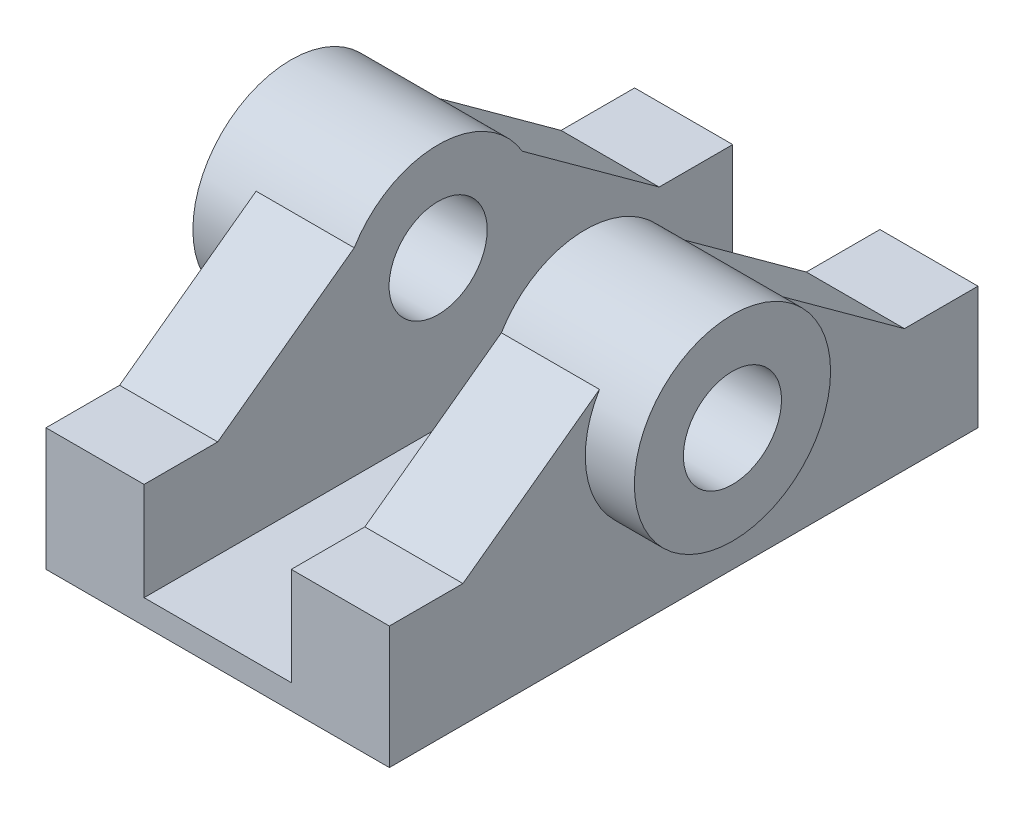
ISO-10303-21;
HEADER;
FILE_DESCRIPTION(('STEP AP214'),'2;1');
FILE_NAME('part.step','',(''),(''),'','','');
FILE_SCHEMA(('AUTOMOTIVE_DESIGN { 1 0 10303 214 1 1 1 1 }'));
ENDSEC;
DATA;
#1=APPLICATION_CONTEXT('core data for automotive mechanical design processes');
#2=APPLICATION_PROTOCOL_DEFINITION('international standard','automotive_design',2000,#1);
#3=PRODUCT_CONTEXT('',#1,'mechanical');
#4=PRODUCT('Part','Part','',(#3));
#5=PRODUCT_RELATED_PRODUCT_CATEGORY('part','',(#4));
#6=PRODUCT_DEFINITION_FORMATION('','',#4);
#7=PRODUCT_DEFINITION_CONTEXT('part definition',#1,'design');
#8=PRODUCT_DEFINITION('design','',#6,#7);
#9=PRODUCT_DEFINITION_SHAPE('','',#8);
#10=(LENGTH_UNIT() NAMED_UNIT(*) SI_UNIT(.MILLI.,.METRE.));
#11=(NAMED_UNIT(*) PLANE_ANGLE_UNIT() SI_UNIT($,.RADIAN.));
#12=(NAMED_UNIT(*) SI_UNIT($,.STERADIAN.) SOLID_ANGLE_UNIT());
#13=UNCERTAINTY_MEASURE_WITH_UNIT(LENGTH_MEASURE(1.E-05),#10,'distance_accuracy_value','');
#14=(GEOMETRIC_REPRESENTATION_CONTEXT(3) GLOBAL_UNCERTAINTY_ASSIGNED_CONTEXT((#13)) GLOBAL_UNIT_ASSIGNED_CONTEXT((#10,
#11,#12)) REPRESENTATION_CONTEXT('',''));
#15=CARTESIAN_POINT('',(0.,0.,0.));
#16=DIRECTION('',(0.,0.,1.));
#17=DIRECTION('',(1.,0.,0.));
#18=AXIS2_PLACEMENT_3D('',#15,#16,#17);
#19=CARTESIAN_POINT('',(-20.,40.0649013305199,-29.114446320478));
#20=DIRECTION('',(0.,0.808963302781296,-0.587859145334303));
#21=DIRECTION('',(0.,0.587859145334303,0.808963302781296));
#22=AXIS2_PLACEMENT_3D('',#19,#20,#21);
#23=PLANE('',#22);
#24=DIRECTION('',(0.,0.587859145334303,0.808963302781296));
#25=VECTOR('',#24,1.);
#26=CARTESIAN_POINT('',(0.,40.0649013305199,-29.114446320478));
#27=LINE('',#26,#25);
#28=CARTESIAN_POINT('',(0.,25.,-49.8455218393954));
#29=VERTEX_POINT('',#28);
#30=CARTESIAN_POINT('',(0.,45.2708196570423,-21.9504906061575));
#31=VERTEX_POINT('',#30);
#32=EDGE_CURVE('E147',#29,#31,#27,.T.);
#33=ORIENTED_EDGE('',*,*,#32,.F.);
#34=DIRECTION('',(1.,0.,0.));
#35=VECTOR('',#34,1.);
#36=CARTESIAN_POINT('',(-20.,25.,-49.8455218393954));
#37=LINE('',#36,#35);
#38=CARTESIAN_POINT('',(-20.,25.,-49.8455218393954));
#39=VERTEX_POINT('',#38);
#40=EDGE_CURVE('E47',#39,#29,#37,.T.);
#41=ORIENTED_EDGE('',*,*,#40,.F.);
#42=DIRECTION('',(0.,0.587859145334303,0.808963302781296));
#43=VECTOR('',#42,1.);
#44=CARTESIAN_POINT('',(-20.,40.0649013305199,-29.114446320478));
#45=LINE('',#44,#43);
#46=CARTESIAN_POINT('',(-20.,45.2708196570423,-21.9504906061575));
#47=VERTEX_POINT('',#46);
#48=EDGE_CURVE('E166',#39,#47,#45,.T.);
#49=ORIENTED_EDGE('',*,*,#48,.T.);
#50=DIRECTION('',(1.,0.,0.));
#51=VECTOR('',#50,1.);
#52=CARTESIAN_POINT('',(-20.,45.2708196570423,-21.9504906061575));
#53=LINE('',#52,#51);
#54=EDGE_CURVE('E42',#47,#31,#53,.T.);
#55=ORIENTED_EDGE('',*,*,#54,.T.);
#56=EDGE_LOOP('',(#33,#41,#49,#55));
#57=FACE_BOUND('',#56,.T.);
#58=ADVANCED_FACE('F39',(#57),#23,.T.);
#59=CARTESIAN_POINT('',(-20.,25.,0.));
#60=DIRECTION('',(0.,1.,0.));
#61=DIRECTION('',(0.,0.,1.));
#62=AXIS2_PLACEMENT_3D('',#59,#60,#61);
#63=PLANE('',#62);
#64=DIRECTION('',(0.,0.,1.));
#65=VECTOR('',#64,1.);
#66=CARTESIAN_POINT('',(0.,25.,0.));
#67=LINE('',#66,#65);
#68=CARTESIAN_POINT('',(0.,25.,-64.8455218393954));
#69=VERTEX_POINT('',#68);
#70=EDGE_CURVE('E163',#69,#29,#67,.T.);
#71=ORIENTED_EDGE('',*,*,#70,.F.);
#72=DIRECTION('',(1.,0.,0.));
#73=VECTOR('',#72,1.);
#74=CARTESIAN_POINT('',(-20.,25.,-64.8455218393954));
#75=LINE('',#74,#73);
#76=CARTESIAN_POINT('',(-20.,25.,-64.8455218393954));
#77=VERTEX_POINT('',#76);
#78=EDGE_CURVE('E168',#77,#69,#75,.T.);
#79=ORIENTED_EDGE('',*,*,#78,.F.);
#80=DIRECTION('',(0.,0.,1.));
#81=VECTOR('',#80,1.);
#82=CARTESIAN_POINT('',(-20.,25.,0.));
#83=LINE('',#82,#81);
#84=EDGE_CURVE('E142',#77,#39,#83,.T.);
#85=ORIENTED_EDGE('',*,*,#84,.T.);
#86=ORIENTED_EDGE('',*,*,#40,.T.);
#87=EDGE_LOOP('',(#71,#79,#85,#86));
#88=FACE_BOUND('',#87,.T.);
#89=ADVANCED_FACE('F184',(#88),#63,.T.);
#90=CARTESIAN_POINT('',(-20.,0.,-64.8455218393954));
#91=DIRECTION('',(0.,0.,-1.));
#92=DIRECTION('',(0.,1.,0.));
#93=AXIS2_PLACEMENT_3D('',#90,#91,#92);
#94=PLANE('',#93);
#95=DIRECTION('',(0.,1.,0.));
#96=VECTOR('',#95,1.);
#97=CARTESIAN_POINT('',(0.,0.,-64.8455218393954));
#98=LINE('',#97,#96);
#99=CARTESIAN_POINT('',(0.,0.,-64.8455218393954));
#100=VERTEX_POINT('',#99);
#101=EDGE_CURVE('E160',#100,#69,#98,.T.);
#102=ORIENTED_EDGE('',*,*,#101,.F.);
#103=DIRECTION('',(1.,0.,0.));
#104=VECTOR('',#103,1.);
#105=CARTESIAN_POINT('',(-20.,0.,-64.8455218393954));
#106=LINE('',#105,#104);
#107=CARTESIAN_POINT('',(-70.,0.,-64.8455218393954));
#108=VERTEX_POINT('',#107);
#109=EDGE_CURVE('E170',#108,#100,#106,.T.);
#110=ORIENTED_EDGE('',*,*,#109,.F.);
#111=DIRECTION('',(0.,1.,0.));
#112=VECTOR('',#111,1.);
#113=CARTESIAN_POINT('',(-70.,0.,-64.8455218393954));
#114=LINE('',#113,#112);
#115=CARTESIAN_POINT('',(-70.,25.,-64.8455218393954));
#116=VERTEX_POINT('',#115);
#117=EDGE_CURVE('E223',#108,#116,#114,.T.);
#118=ORIENTED_EDGE('',*,*,#117,.T.);
#119=DIRECTION('',(-1.,0.,0.));
#120=VECTOR('',#119,1.);
#121=CARTESIAN_POINT('',(-50.,25.,-64.8455218393954));
#122=LINE('',#121,#120);
#123=CARTESIAN_POINT('',(-50.,25.,-64.8455218393954));
#124=VERTEX_POINT('',#123);
#125=EDGE_CURVE('E213',#124,#116,#122,.T.);
#126=ORIENTED_EDGE('',*,*,#125,.F.);
#127=DIRECTION('',(0.,1.,0.));
#128=VECTOR('',#127,1.);
#129=CARTESIAN_POINT('',(-50.,0.,-64.8455218393954));
#130=LINE('',#129,#128);
#131=CARTESIAN_POINT('',(-50.,5.,-64.8455218393954));
#132=VERTEX_POINT('',#131);
#133=EDGE_CURVE('E247',#132,#124,#130,.T.);
#134=ORIENTED_EDGE('',*,*,#133,.F.);
#135=DIRECTION('',(-1.,0.,0.));
#136=VECTOR('',#135,1.);
#137=CARTESIAN_POINT('',(-35.,5.,-64.8455218393954));
#138=LINE('',#137,#136);
#139=CARTESIAN_POINT('',(-20.,5.,-64.8455218393954));
#140=VERTEX_POINT('',#139);
#141=EDGE_CURVE('E195',#140,#132,#138,.T.);
#142=ORIENTED_EDGE('',*,*,#141,.F.);
#143=DIRECTION('',(0.,1.,0.));
#144=VECTOR('',#143,1.);
#145=CARTESIAN_POINT('',(-20.,0.,-64.8455218393954));
#146=LINE('',#145,#144);
#147=EDGE_CURVE('E120',#140,#77,#146,.T.);
#148=ORIENTED_EDGE('',*,*,#147,.T.);
#149=ORIENTED_EDGE('',*,*,#78,.T.);
#150=EDGE_LOOP('',(#102,#110,#118,#126,#134,#142,#148,#149));
#151=FACE_BOUND('',#150,.T.);
#152=ADVANCED_FACE('F318',(#151),#94,.T.);
#153=CARTESIAN_POINT('',(-20.,0.,0.));
#154=DIRECTION('',(0.,-1.,0.));
#155=DIRECTION('',(0.,0.,-1.));
#156=AXIS2_PLACEMENT_3D('',#153,#154,#155);
#157=PLANE('',#156);
#158=DIRECTION('',(0.,0.,-1.));
#159=VECTOR('',#158,1.);
#160=CARTESIAN_POINT('',(0.,0.,0.));
#161=LINE('',#160,#159);
#162=CARTESIAN_POINT('',(0.,0.,55.1544781606046));
#163=VERTEX_POINT('',#162);
#164=EDGE_CURVE('E157',#163,#100,#161,.T.);
#165=ORIENTED_EDGE('',*,*,#164,.F.);
#166=DIRECTION('',(1.,0.,0.));
#167=VECTOR('',#166,1.);
#168=CARTESIAN_POINT('',(-20.,0.,55.1544781606046));
#169=LINE('',#168,#167);
#170=CARTESIAN_POINT('',(-70.,0.,55.1544781606046));
#171=VERTEX_POINT('',#170);
#172=EDGE_CURVE('E129',#171,#163,#169,.T.);
#173=ORIENTED_EDGE('',*,*,#172,.F.);
#174=DIRECTION('',(0.,0.,-1.));
#175=VECTOR('',#174,1.);
#176=CARTESIAN_POINT('',(-70.,0.,0.));
#177=LINE('',#176,#175);
#178=EDGE_CURVE('E226',#171,#108,#177,.T.);
#179=ORIENTED_EDGE('',*,*,#178,.T.);
#180=ORIENTED_EDGE('',*,*,#109,.T.);
#181=EDGE_LOOP('',(#165,#173,#179,#180));
#182=FACE_BOUND('',#181,.T.);
#183=ADVANCED_FACE('F349',(#182),#157,.T.);
#184=CARTESIAN_POINT('',(-20.,0.,55.1544781606046));
#185=DIRECTION('',(0.,0.,-1.));
#186=DIRECTION('',(-1.,0.,0.));
#187=AXIS2_PLACEMENT_3D('',#184,#185,#186);
#188=PLANE('',#187);
#189=DIRECTION('',(0.,1.,0.));
#190=VECTOR('',#189,1.);
#191=CARTESIAN_POINT('',(0.,0.,55.1544781606046));
#192=LINE('',#191,#190);
#193=CARTESIAN_POINT('',(0.,25.,55.1544781606046));
#194=VERTEX_POINT('',#193);
#195=EDGE_CURVE('E126',#163,#194,#192,.T.);
#196=ORIENTED_EDGE('',*,*,#195,.T.);
#197=DIRECTION('',(1.,0.,0.));
#198=VECTOR('',#197,1.);
#199=CARTESIAN_POINT('',(-20.,25.,55.1544781606046));
#200=LINE('',#199,#198);
#201=CARTESIAN_POINT('',(-20.,25.,55.1544781606046));
#202=VERTEX_POINT('',#201);
#203=EDGE_CURVE('E123',#202,#194,#200,.T.);
#204=ORIENTED_EDGE('',*,*,#203,.F.);
#205=DIRECTION('',(0.,1.,0.));
#206=VECTOR('',#205,1.);
#207=CARTESIAN_POINT('',(-20.,0.,55.1544781606046));
#208=LINE('',#207,#206);
#209=CARTESIAN_POINT('',(-20.,5.,55.1544781606046));
#210=VERTEX_POINT('',#209);
#211=EDGE_CURVE('E110',#210,#202,#208,.T.);
#212=ORIENTED_EDGE('',*,*,#211,.F.);
#213=DIRECTION('',(-1.,0.,0.));
#214=VECTOR('',#213,1.);
#215=CARTESIAN_POINT('',(-35.,5.,55.1544781606046));
#216=LINE('',#215,#214);
#217=CARTESIAN_POINT('',(-50.,5.,55.1544781606046));
#218=VERTEX_POINT('',#217);
#219=EDGE_CURVE('E55',#210,#218,#216,.T.);
#220=ORIENTED_EDGE('',*,*,#219,.T.);
#221=DIRECTION('',(0.,1.,0.));
#222=VECTOR('',#221,1.);
#223=CARTESIAN_POINT('',(-50.,0.,55.1544781606046));
#224=LINE('',#223,#222);
#225=CARTESIAN_POINT('',(-50.,25.,55.1544781606046));
#226=VERTEX_POINT('',#225);
#227=EDGE_CURVE('E250',#218,#226,#224,.T.);
#228=ORIENTED_EDGE('',*,*,#227,.T.);
#229=DIRECTION('',(-1.,0.,0.));
#230=VECTOR('',#229,1.);
#231=CARTESIAN_POINT('',(-50.,25.,55.1544781606046));
#232=LINE('',#231,#230);
#233=CARTESIAN_POINT('',(-70.,25.,55.1544781606046));
#234=VERTEX_POINT('',#233);
#235=EDGE_CURVE('E210',#226,#234,#232,.T.);
#236=ORIENTED_EDGE('',*,*,#235,.T.);
#237=DIRECTION('',(0.,1.,0.));
#238=VECTOR('',#237,1.);
#239=CARTESIAN_POINT('',(-70.,0.,55.1544781606046));
#240=LINE('',#239,#238);
#241=EDGE_CURVE('E229',#171,#234,#240,.T.);
#242=ORIENTED_EDGE('',*,*,#241,.F.);
#243=ORIENTED_EDGE('',*,*,#172,.T.);
#244=EDGE_LOOP('',(#196,#204,#212,#220,#228,#236,#242,#243));
#245=FACE_BOUND('',#244,.T.);
#246=ADVANCED_FACE('F124',(#245),#188,.F.);
#247=CARTESIAN_POINT('',(-20.,25.,0.));
#248=DIRECTION('',(0.,-1.,0.));
#249=DIRECTION('',(0.,0.,-1.));
#250=AXIS2_PLACEMENT_3D('',#247,#248,#249);
#251=PLANE('',#250);
#252=DIRECTION('',(0.,0.,-1.));
#253=VECTOR('',#252,1.);
#254=CARTESIAN_POINT('',(0.,25.,0.));
#255=LINE('',#254,#253);
#256=CARTESIAN_POINT('',(0.,25.,40.1544781606046));
#257=VERTEX_POINT('',#256);
#258=EDGE_CURVE('E154',#194,#257,#255,.T.);
#259=ORIENTED_EDGE('',*,*,#258,.T.);
#260=DIRECTION('',(1.,0.,0.));
#261=VECTOR('',#260,1.);
#262=CARTESIAN_POINT('',(-20.,25.,40.1544781606046));
#263=LINE('',#262,#261);
#264=CARTESIAN_POINT('',(-20.,25.,40.1544781606046));
#265=VERTEX_POINT('',#264);
#266=EDGE_CURVE('E130',#265,#257,#263,.T.);
#267=ORIENTED_EDGE('',*,*,#266,.F.);
#268=DIRECTION('',(0.,0.,-1.));
#269=VECTOR('',#268,1.);
#270=CARTESIAN_POINT('',(-20.,25.,0.));
#271=LINE('',#270,#269);
#272=EDGE_CURVE('E116',#202,#265,#271,.T.);
#273=ORIENTED_EDGE('',*,*,#272,.F.);
#274=ORIENTED_EDGE('',*,*,#203,.T.);
#275=EDGE_LOOP('',(#259,#267,#273,#274));
#276=FACE_BOUND('',#275,.T.);
#277=ADVANCED_FACE('F132',(#276),#251,.F.);
#278=CARTESIAN_POINT('',(-20.,35.4212757104404,25.9048156686958));
#279=DIRECTION('',(0.,-0.807173552318652,-0.590314201453166));
#280=DIRECTION('',(0.,0.590314201453166,-0.807173552318652));
#281=AXIS2_PLACEMENT_3D('',#278,#279,#280);
#282=PLANE('',#281);
#283=DIRECTION('',(0.,0.590314201453166,-0.807173552318652));
#284=VECTOR('',#283,1.);
#285=CARTESIAN_POINT('',(0.,35.4212757104404,25.9048156686958));
#286=LINE('',#285,#284);
#287=CARTESIAN_POINT('',(0.,45.3554759904996,12.3211618962454));
#288=VERTEX_POINT('',#287);
#289=EDGE_CURVE('E150',#257,#288,#286,.T.);
#290=ORIENTED_EDGE('',*,*,#289,.T.);
#291=DIRECTION('',(1.,0.,0.));
#292=VECTOR('',#291,1.);
#293=CARTESIAN_POINT('',(-20.,45.3554759904996,12.3211618962454));
#294=LINE('',#293,#292);
#295=CARTESIAN_POINT('',(-20.,45.3554759904996,12.3211618962454));
#296=VERTEX_POINT('',#295);
#297=EDGE_CURVE('E173',#296,#288,#294,.T.);
#298=ORIENTED_EDGE('',*,*,#297,.F.);
#299=DIRECTION('',(0.,0.590314201453166,-0.807173552318652));
#300=VECTOR('',#299,1.);
#301=CARTESIAN_POINT('',(-20.,35.4212757104404,25.9048156686958));
#302=LINE('',#301,#300);
#303=EDGE_CURVE('E135',#265,#296,#302,.T.);
#304=ORIENTED_EDGE('',*,*,#303,.F.);
#305=ORIENTED_EDGE('',*,*,#266,.T.);
#306=EDGE_LOOP('',(#290,#298,#304,#305));
#307=FACE_BOUND('',#306,.T.);
#308=ADVANCED_FACE('F469',(#307),#282,.F.);
#309=CARTESIAN_POINT('',(-20.,35.,-4.7891892693557));
#310=DIRECTION('',(1.,0.,0.));
#311=DIRECTION('',(0.,0.,-1.));
#312=AXIS2_PLACEMENT_3D('',#309,#310,#311);
#313=CYLINDRICAL_SURFACE('',#312,20.);
#314=ORIENTED_EDGE('',*,*,#297,.T.);
#315=CARTESIAN_POINT('',(0.,35.,-4.7891892693557));
#316=DIRECTION('',(1.,0.,0.));
#317=DIRECTION('',(0.,0.,-1.));
#318=AXIS2_PLACEMENT_3D('',#315,#316,#317);
#319=CIRCLE('',#318,20.);
#320=EDGE_CURVE('E11',#288,#31,#319,.T.);
#321=ORIENTED_EDGE('',*,*,#320,.T.);
#322=ORIENTED_EDGE('',*,*,#54,.F.);
#323=CARTESIAN_POINT('',(-20.,35.,-4.7891892693557));
#324=DIRECTION('',(1.,0.,0.));
#325=DIRECTION('',(0.,0.,-1.));
#326=AXIS2_PLACEMENT_3D('',#323,#324,#325);
#327=CIRCLE('',#326,20.);
#328=EDGE_CURVE('E137',#47,#296,#327,.T.);
#329=ORIENTED_EDGE('',*,*,#328,.T.);
#330=EDGE_LOOP('',(#314,#321,#322,#329));
#331=FACE_BOUND('',#330,.T.);
#332=CARTESIAN_POINT('',(10.,35.,-4.7891892693557));
#333=DIRECTION('',(1.,0.,0.));
#334=DIRECTION('',(0.,0.,-1.));
#335=AXIS2_PLACEMENT_3D('',#332,#333,#334);
#336=CIRCLE('',#335,20.);
#337=CARTESIAN_POINT('',(10.,35.,-24.7891892693557));
#338=VERTEX_POINT('',#337);
#339=EDGE_CURVE('E151',#338,#338,#336,.T.);
#340=ORIENTED_EDGE('',*,*,#339,.F.);
#341=EDGE_LOOP('',(#340));
#342=FACE_BOUND('',#341,.T.);
#343=ADVANCED_FACE('F177',(#331,#342),#313,.T.);
#344=CARTESIAN_POINT('',(-20.,35.,-4.7891892693557));
#345=DIRECTION('',(1.,0.,0.));
#346=DIRECTION('',(0.,0.,-1.));
#347=AXIS2_PLACEMENT_3D('',#344,#345,#346);
#348=CYLINDRICAL_SURFACE('',#347,10.);
#349=CARTESIAN_POINT('',(-20.,35.,-4.7891892693557));
#350=DIRECTION('',(1.,0.,0.));
#351=DIRECTION('',(0.,0.,-1.));
#352=AXIS2_PLACEMENT_3D('',#349,#350,#351);
#353=CIRCLE('',#352,10.);
#354=CARTESIAN_POINT('',(-20.,35.,-14.7891892693557));
#355=VERTEX_POINT('',#354);
#356=EDGE_CURVE('E144',#355,#355,#353,.T.);
#357=ORIENTED_EDGE('',*,*,#356,.F.);
#358=EDGE_LOOP('',(#357));
#359=FACE_BOUND('',#358,.T.);
#360=CARTESIAN_POINT('',(10.,35.,-4.7891892693557));
#361=DIRECTION('',(1.,0.,0.));
#362=DIRECTION('',(0.,0.,-1.));
#363=AXIS2_PLACEMENT_3D('',#360,#361,#362);
#364=CIRCLE('',#363,10.);
#365=CARTESIAN_POINT('',(10.,35.,-14.7891892693557));
#366=VERTEX_POINT('',#365);
#367=EDGE_CURVE('E191',#366,#366,#364,.T.);
#368=ORIENTED_EDGE('',*,*,#367,.T.);
#369=EDGE_LOOP('',(#368));
#370=FACE_BOUND('',#369,.T.);
#371=ADVANCED_FACE('F366',(#359,#370),#348,.F.);
#372=CARTESIAN_POINT('',(-20.,0.,0.));
#373=DIRECTION('',(1.,0.,0.));
#374=DIRECTION('',(0.,0.,-1.));
#375=AXIS2_PLACEMENT_3D('',#372,#373,#374);
#376=PLANE('',#375);
#377=ORIENTED_EDGE('',*,*,#147,.F.);
#378=DIRECTION('',(0.,0.,1.));
#379=VECTOR('',#378,1.);
#380=CARTESIAN_POINT('',(-20.,5.,-64.8455218393954));
#381=LINE('',#380,#379);
#382=EDGE_CURVE('E118',#140,#210,#381,.T.);
#383=ORIENTED_EDGE('',*,*,#382,.T.);
#384=ORIENTED_EDGE('',*,*,#211,.T.);
#385=ORIENTED_EDGE('',*,*,#272,.T.);
#386=ORIENTED_EDGE('',*,*,#303,.T.);
#387=ORIENTED_EDGE('',*,*,#328,.F.);
#388=ORIENTED_EDGE('',*,*,#48,.F.);
#389=ORIENTED_EDGE('',*,*,#84,.F.);
#390=EDGE_LOOP('',(#377,#383,#384,#385,#386,#387,#388,#389));
#391=FACE_BOUND('',#390,.T.);
#392=ORIENTED_EDGE('',*,*,#356,.T.);
#393=EDGE_LOOP('',(#392));
#394=FACE_BOUND('',#393,.T.);
#395=ADVANCED_FACE('F113',(#391,#394),#376,.F.);
#396=CARTESIAN_POINT('',(0.,0.,0.));
#397=DIRECTION('',(1.,0.,0.));
#398=DIRECTION('',(0.,0.,-1.));
#399=AXIS2_PLACEMENT_3D('',#396,#397,#398);
#400=PLANE('',#399);
#401=ORIENTED_EDGE('',*,*,#320,.F.);
#402=ORIENTED_EDGE('',*,*,#289,.F.);
#403=ORIENTED_EDGE('',*,*,#258,.F.);
#404=ORIENTED_EDGE('',*,*,#195,.F.);
#405=ORIENTED_EDGE('',*,*,#164,.T.);
#406=ORIENTED_EDGE('',*,*,#101,.T.);
#407=ORIENTED_EDGE('',*,*,#70,.T.);
#408=ORIENTED_EDGE('',*,*,#32,.T.);
#409=EDGE_LOOP('',(#401,#402,#403,#404,#405,#406,#407,#408));
#410=FACE_BOUND('',#409,.T.);
#411=ADVANCED_FACE('F181',(#410),#400,.T.);
#412=CARTESIAN_POINT('',(10.,35.,-4.7891892693557));
#413=DIRECTION('',(1.,0.,0.));
#414=DIRECTION('',(0.,0.,-1.));
#415=AXIS2_PLACEMENT_3D('',#412,#413,#414);
#416=PLANE('',#415);
#417=ORIENTED_EDGE('',*,*,#339,.T.);
#418=EDGE_LOOP('',(#417));
#419=FACE_BOUND('',#418,.T.);
#420=ORIENTED_EDGE('',*,*,#367,.F.);
#421=EDGE_LOOP('',(#420));
#422=FACE_BOUND('',#421,.T.);
#423=ADVANCED_FACE('F372',(#419,#422),#416,.T.);
#424=CARTESIAN_POINT('',(-35.,5.,-64.8455218393954));
#425=DIRECTION('',(0.,1.,0.));
#426=DIRECTION('',(0.,0.,1.));
#427=AXIS2_PLACEMENT_3D('',#424,#425,#426);
#428=PLANE('',#427);
#429=ORIENTED_EDGE('',*,*,#219,.F.);
#430=ORIENTED_EDGE('',*,*,#382,.F.);
#431=ORIENTED_EDGE('',*,*,#141,.T.);
#432=DIRECTION('',(0.,0.,1.));
#433=VECTOR('',#432,1.);
#434=CARTESIAN_POINT('',(-50.,5.,-64.8455218393954));
#435=LINE('',#434,#433);
#436=EDGE_CURVE('E271',#132,#218,#435,.T.);
#437=ORIENTED_EDGE('',*,*,#436,.T.);
#438=EDGE_LOOP('',(#429,#430,#431,#437));
#439=FACE_BOUND('',#438,.T.);
#440=ADVANCED_FACE('F275',(#439),#428,.T.);
#441=CARTESIAN_POINT('',(-50.,40.0649013305199,-29.114446320478));
#442=DIRECTION('',(0.,0.808963302781296,-0.587859145334303));
#443=DIRECTION('',(0.,0.587859145334303,0.808963302781296));
#444=AXIS2_PLACEMENT_3D('',#441,#442,#443);
#445=PLANE('',#444);
#446=DIRECTION('',(0.,0.587859145334303,0.808963302781296));
#447=VECTOR('',#446,1.);
#448=CARTESIAN_POINT('',(-70.,40.0649013305199,-29.114446320478));
#449=LINE('',#448,#447);
#450=CARTESIAN_POINT('',(-70.,25.,-49.8455218393954));
#451=VERTEX_POINT('',#450);
#452=CARTESIAN_POINT('',(-70.,45.2708196570423,-21.9504906061575));
#453=VERTEX_POINT('',#452);
#454=EDGE_CURVE('E238',#451,#453,#449,.T.);
#455=ORIENTED_EDGE('',*,*,#454,.T.);
#456=DIRECTION('',(-1.,0.,0.));
#457=VECTOR('',#456,1.);
#458=CARTESIAN_POINT('',(-50.,45.2708196570423,-21.9504906061575));
#459=LINE('',#458,#457);
#460=CARTESIAN_POINT('',(-50.,45.2708196570423,-21.9504906061575));
#461=VERTEX_POINT('',#460);
#462=EDGE_CURVE('E200',#461,#453,#459,.T.);
#463=ORIENTED_EDGE('',*,*,#462,.F.);
#464=DIRECTION('',(0.,0.587859145334303,0.808963302781296));
#465=VECTOR('',#464,1.);
#466=CARTESIAN_POINT('',(-50.,40.0649013305199,-29.114446320478));
#467=LINE('',#466,#465);
#468=CARTESIAN_POINT('',(-50.,25.,-49.8455218393954));
#469=VERTEX_POINT('',#468);
#470=EDGE_CURVE('E222',#469,#461,#467,.T.);
#471=ORIENTED_EDGE('',*,*,#470,.F.);
#472=DIRECTION('',(-1.,0.,0.));
#473=VECTOR('',#472,1.);
#474=CARTESIAN_POINT('',(-50.,25.,-49.8455218393954));
#475=LINE('',#474,#473);
#476=EDGE_CURVE('E216',#469,#451,#475,.T.);
#477=ORIENTED_EDGE('',*,*,#476,.T.);
#478=EDGE_LOOP('',(#455,#463,#471,#477));
#479=FACE_BOUND('',#478,.T.);
#480=ADVANCED_FACE('F330',(#479),#445,.T.);
#481=CARTESIAN_POINT('',(-50.,25.,0.));
#482=DIRECTION('',(0.,1.,0.));
#483=DIRECTION('',(0.,0.,1.));
#484=AXIS2_PLACEMENT_3D('',#481,#482,#483);
#485=PLANE('',#484);
#486=DIRECTION('',(0.,0.,1.));
#487=VECTOR('',#486,1.);
#488=CARTESIAN_POINT('',(-70.,25.,0.));
#489=LINE('',#488,#487);
#490=EDGE_CURVE('E219',#116,#451,#489,.T.);
#491=ORIENTED_EDGE('',*,*,#490,.T.);
#492=ORIENTED_EDGE('',*,*,#476,.F.);
#493=DIRECTION('',(0.,0.,1.));
#494=VECTOR('',#493,1.);
#495=CARTESIAN_POINT('',(-50.,25.,0.));
#496=LINE('',#495,#494);
#497=EDGE_CURVE('E244',#124,#469,#496,.T.);
#498=ORIENTED_EDGE('',*,*,#497,.F.);
#499=ORIENTED_EDGE('',*,*,#125,.T.);
#500=EDGE_LOOP('',(#491,#492,#498,#499));
#501=FACE_BOUND('',#500,.T.);
#502=ADVANCED_FACE('F326',(#501),#485,.T.);
#503=CARTESIAN_POINT('',(-50.,25.,0.));
#504=DIRECTION('',(0.,-1.,0.));
#505=DIRECTION('',(0.,0.,-1.));
#506=AXIS2_PLACEMENT_3D('',#503,#504,#505);
#507=PLANE('',#506);
#508=DIRECTION('',(0.,0.,-1.));
#509=VECTOR('',#508,1.);
#510=CARTESIAN_POINT('',(-70.,25.,0.));
#511=LINE('',#510,#509);
#512=CARTESIAN_POINT('',(-70.,25.,40.1544781606046));
#513=VERTEX_POINT('',#512);
#514=EDGE_CURVE('E232',#234,#513,#511,.T.);
#515=ORIENTED_EDGE('',*,*,#514,.F.);
#516=ORIENTED_EDGE('',*,*,#235,.F.);
#517=DIRECTION('',(0.,0.,-1.));
#518=VECTOR('',#517,1.);
#519=CARTESIAN_POINT('',(-50.,25.,0.));
#520=LINE('',#519,#518);
#521=CARTESIAN_POINT('',(-50.,25.,40.1544781606046));
#522=VERTEX_POINT('',#521);
#523=EDGE_CURVE('E253',#226,#522,#520,.T.);
#524=ORIENTED_EDGE('',*,*,#523,.T.);
#525=DIRECTION('',(-1.,0.,0.));
#526=VECTOR('',#525,1.);
#527=CARTESIAN_POINT('',(-50.,25.,40.1544781606046));
#528=LINE('',#527,#526);
#529=EDGE_CURVE('E207',#522,#513,#528,.T.);
#530=ORIENTED_EDGE('',*,*,#529,.T.);
#531=EDGE_LOOP('',(#515,#516,#524,#530));
#532=FACE_BOUND('',#531,.T.);
#533=ADVANCED_FACE('F343',(#532),#507,.F.);
#534=CARTESIAN_POINT('',(-50.,35.4212757104404,25.9048156686958));
#535=DIRECTION('',(0.,-0.807173552318652,-0.590314201453166));
#536=DIRECTION('',(0.,0.590314201453166,-0.807173552318652));
#537=AXIS2_PLACEMENT_3D('',#534,#535,#536);
#538=PLANE('',#537);
#539=DIRECTION('',(0.,0.590314201453166,-0.807173552318652));
#540=VECTOR('',#539,1.);
#541=CARTESIAN_POINT('',(-70.,35.4212757104404,25.9048156686958));
#542=LINE('',#541,#540);
#543=CARTESIAN_POINT('',(-70.,45.3554759904996,12.3211618962454));
#544=VERTEX_POINT('',#543);
#545=EDGE_CURVE('E235',#513,#544,#542,.T.);
#546=ORIENTED_EDGE('',*,*,#545,.F.);
#547=ORIENTED_EDGE('',*,*,#529,.F.);
#548=DIRECTION('',(0.,0.590314201453166,-0.807173552318652));
#549=VECTOR('',#548,1.);
#550=CARTESIAN_POINT('',(-50.,35.4212757104404,25.9048156686958));
#551=LINE('',#550,#549);
#552=CARTESIAN_POINT('',(-50.,45.3554759904996,12.3211618962454));
#553=VERTEX_POINT('',#552);
#554=EDGE_CURVE('E256',#522,#553,#551,.T.);
#555=ORIENTED_EDGE('',*,*,#554,.T.);
#556=DIRECTION('',(-1.,0.,0.));
#557=VECTOR('',#556,1.);
#558=CARTESIAN_POINT('',(-50.,45.3554759904996,12.3211618962454));
#559=LINE('',#558,#557);
#560=EDGE_CURVE('E203',#553,#544,#559,.T.);
#561=ORIENTED_EDGE('',*,*,#560,.T.);
#562=EDGE_LOOP('',(#546,#547,#555,#561));
#563=FACE_BOUND('',#562,.T.);
#564=ADVANCED_FACE('F341',(#563),#538,.F.);
#565=CARTESIAN_POINT('',(-50.,35.,-4.7891892693557));
#566=DIRECTION('',(-1.,0.,0.));
#567=DIRECTION('',(0.,0.,-1.));
#568=AXIS2_PLACEMENT_3D('',#565,#566,#567);
#569=CYLINDRICAL_SURFACE('',#568,20.);
#570=ORIENTED_EDGE('',*,*,#560,.F.);
#571=CARTESIAN_POINT('',(-50.,35.,-4.7891892693557));
#572=DIRECTION('',(1.,0.,0.));
#573=DIRECTION('',(0.,0.,-1.));
#574=AXIS2_PLACEMENT_3D('',#571,#572,#573);
#575=CIRCLE('',#574,20.);
#576=EDGE_CURVE('E259',#461,#553,#575,.T.);
#577=ORIENTED_EDGE('',*,*,#576,.F.);
#578=ORIENTED_EDGE('',*,*,#462,.T.);
#579=CARTESIAN_POINT('',(-70.,35.,-4.7891892693557));
#580=DIRECTION('',(1.,0.,0.));
#581=DIRECTION('',(0.,0.,-1.));
#582=AXIS2_PLACEMENT_3D('',#579,#580,#581);
#583=CIRCLE('',#582,20.);
#584=EDGE_CURVE('E197',#544,#453,#583,.T.);
#585=ORIENTED_EDGE('',*,*,#584,.F.);
#586=EDGE_LOOP('',(#570,#577,#578,#585));
#587=FACE_BOUND('',#586,.T.);
#588=CARTESIAN_POINT('',(-80.,35.,-4.7891892693557));
#589=DIRECTION('',(1.,0.,0.));
#590=DIRECTION('',(0.,0.,-1.));
#591=AXIS2_PLACEMENT_3D('',#588,#589,#590);
#592=CIRCLE('',#591,20.);
#593=CARTESIAN_POINT('',(-80.,35.,-24.7891892693557));
#594=VERTEX_POINT('',#593);
#595=EDGE_CURVE('E241',#594,#594,#592,.T.);
#596=ORIENTED_EDGE('',*,*,#595,.T.);
#597=EDGE_LOOP('',(#596));
#598=FACE_BOUND('',#597,.T.);
#599=ADVANCED_FACE('F335',(#587,#598),#569,.T.);
#600=CARTESIAN_POINT('',(-50.,35.,-4.7891892693557));
#601=DIRECTION('',(-1.,0.,0.));
#602=DIRECTION('',(0.,0.,-1.));
#603=AXIS2_PLACEMENT_3D('',#600,#601,#602);
#604=CYLINDRICAL_SURFACE('',#603,10.);
#605=CARTESIAN_POINT('',(-50.,35.,-4.7891892693557));
#606=DIRECTION('',(1.,0.,0.));
#607=DIRECTION('',(0.,0.,-1.));
#608=AXIS2_PLACEMENT_3D('',#605,#606,#607);
#609=CIRCLE('',#608,10.);
#610=CARTESIAN_POINT('',(-50.,35.,-14.7891892693557));
#611=VERTEX_POINT('',#610);
#612=EDGE_CURVE('E204',#611,#611,#609,.T.);
#613=ORIENTED_EDGE('',*,*,#612,.T.);
#614=EDGE_LOOP('',(#613));
#615=FACE_BOUND('',#614,.T.);
#616=CARTESIAN_POINT('',(-80.,35.,-4.7891892693557));
#617=DIRECTION('',(1.,0.,0.));
#618=DIRECTION('',(0.,0.,-1.));
#619=AXIS2_PLACEMENT_3D('',#616,#617,#618);
#620=CIRCLE('',#619,10.);
#621=CARTESIAN_POINT('',(-80.,35.,-14.7891892693557));
#622=VERTEX_POINT('',#621);
#623=EDGE_CURVE('E268',#622,#622,#620,.T.);
#624=ORIENTED_EDGE('',*,*,#623,.F.);
#625=EDGE_LOOP('',(#624));
#626=FACE_BOUND('',#625,.T.);
#627=ADVANCED_FACE('F384',(#615,#626),#604,.F.);
#628=CARTESIAN_POINT('',(-50.,0.,0.));
#629=DIRECTION('',(-1.,0.,0.));
#630=DIRECTION('',(0.,0.,-1.));
#631=AXIS2_PLACEMENT_3D('',#628,#629,#630);
#632=PLANE('',#631);
#633=ORIENTED_EDGE('',*,*,#133,.T.);
#634=ORIENTED_EDGE('',*,*,#497,.T.);
#635=ORIENTED_EDGE('',*,*,#470,.T.);
#636=ORIENTED_EDGE('',*,*,#576,.T.);
#637=ORIENTED_EDGE('',*,*,#554,.F.);
#638=ORIENTED_EDGE('',*,*,#523,.F.);
#639=ORIENTED_EDGE('',*,*,#227,.F.);
#640=ORIENTED_EDGE('',*,*,#436,.F.);
#641=EDGE_LOOP('',(#633,#634,#635,#636,#637,#638,#639,#640));
#642=FACE_BOUND('',#641,.T.);
#643=ORIENTED_EDGE('',*,*,#612,.F.);
#644=EDGE_LOOP('',(#643));
#645=FACE_BOUND('',#644,.T.);
#646=ADVANCED_FACE('F283',(#642,#645),#632,.F.);
#647=CARTESIAN_POINT('',(-70.,0.,0.));
#648=DIRECTION('',(-1.,0.,0.));
#649=DIRECTION('',(0.,0.,-1.));
#650=AXIS2_PLACEMENT_3D('',#647,#648,#649);
#651=PLANE('',#650);
#652=ORIENTED_EDGE('',*,*,#584,.T.);
#653=ORIENTED_EDGE('',*,*,#454,.F.);
#654=ORIENTED_EDGE('',*,*,#490,.F.);
#655=ORIENTED_EDGE('',*,*,#117,.F.);
#656=ORIENTED_EDGE('',*,*,#178,.F.);
#657=ORIENTED_EDGE('',*,*,#241,.T.);
#658=ORIENTED_EDGE('',*,*,#514,.T.);
#659=ORIENTED_EDGE('',*,*,#545,.T.);
#660=EDGE_LOOP('',(#652,#653,#654,#655,#656,#657,#658,#659));
#661=FACE_BOUND('',#660,.T.);
#662=ADVANCED_FACE('F344',(#661),#651,.T.);
#663=CARTESIAN_POINT('',(-80.,35.,-4.7891892693557));
#664=DIRECTION('',(-1.,0.,0.));
#665=DIRECTION('',(0.,0.,-1.));
#666=AXIS2_PLACEMENT_3D('',#663,#664,#665);
#667=PLANE('',#666);
#668=ORIENTED_EDGE('',*,*,#595,.F.);
#669=EDGE_LOOP('',(#668));
#670=FACE_BOUND('',#669,.T.);
#671=ORIENTED_EDGE('',*,*,#623,.T.);
#672=EDGE_LOOP('',(#671));
#673=FACE_BOUND('',#672,.T.);
#674=ADVANCED_FACE('F396',(#670,#673),#667,.T.);
#675=CLOSED_SHELL('',(#58,#89,#152,#183,#246,#277,#308,#343,#371,#395,#411,#423,#440,#480,#502,
#533,#564,#599,#627,#646,#662,#674));
#676=MANIFOLD_SOLID_BREP('B2',#675);
#677=ADVANCED_BREP_SHAPE_REPRESENTATION('',(#18,#676),#14);
#678=SHAPE_DEFINITION_REPRESENTATION(#9,#677);
ENDSEC;
END-ISO-10303-21;
